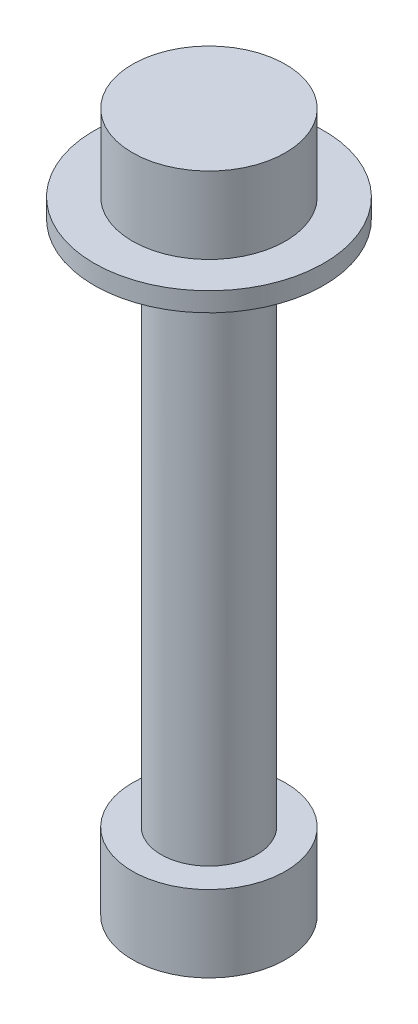
ISO-10303-21;
HEADER;
FILE_DESCRIPTION(('STEP AP214'),'2;1');
FILE_NAME('part.step','',(''),(''),'','','');
FILE_SCHEMA(('AUTOMOTIVE_DESIGN { 1 0 10303 214 1 1 1 1 }'));
ENDSEC;
DATA;
#1=APPLICATION_CONTEXT('core data for automotive mechanical design processes');
#2=APPLICATION_PROTOCOL_DEFINITION('international standard','automotive_design',2000,#1);
#3=PRODUCT_CONTEXT('',#1,'mechanical');
#4=PRODUCT('Part','Part','',(#3));
#5=PRODUCT_RELATED_PRODUCT_CATEGORY('part','',(#4));
#6=PRODUCT_DEFINITION_FORMATION('','',#4);
#7=PRODUCT_DEFINITION_CONTEXT('part definition',#1,'design');
#8=PRODUCT_DEFINITION('design','',#6,#7);
#9=PRODUCT_DEFINITION_SHAPE('','',#8);
#10=(LENGTH_UNIT() NAMED_UNIT(*) SI_UNIT(.MILLI.,.METRE.));
#11=(NAMED_UNIT(*) PLANE_ANGLE_UNIT() SI_UNIT($,.RADIAN.));
#12=(NAMED_UNIT(*) SI_UNIT($,.STERADIAN.) SOLID_ANGLE_UNIT());
#13=UNCERTAINTY_MEASURE_WITH_UNIT(LENGTH_MEASURE(1.E-05),#10,'distance_accuracy_value','');
#14=(GEOMETRIC_REPRESENTATION_CONTEXT(3) GLOBAL_UNCERTAINTY_ASSIGNED_CONTEXT((#13)) GLOBAL_UNIT_ASSIGNED_CONTEXT((#10,
#11,#12)) REPRESENTATION_CONTEXT('',''));
#15=CARTESIAN_POINT('',(0.,0.,0.));
#16=DIRECTION('',(0.,0.,1.));
#17=DIRECTION('',(1.,0.,0.));
#18=AXIS2_PLACEMENT_3D('',#15,#16,#17);
#19=CARTESIAN_POINT('',(0.,36.195,0.));
#20=DIRECTION('',(0.,1.,0.));
#21=DIRECTION('',(0.,0.,1.));
#22=AXIS2_PLACEMENT_3D('',#19,#20,#21);
#23=PLANE('',#22);
#24=CARTESIAN_POINT('',(0.,36.195,0.));
#25=DIRECTION('',(0.,1.,0.));
#26=DIRECTION('',(0.,0.,1.));
#27=AXIS2_PLACEMENT_3D('',#24,#25,#26);
#28=CIRCLE('',#27,7.62);
#29=CARTESIAN_POINT('',(0.,36.195,7.62));
#30=VERTEX_POINT('',#29);
#31=EDGE_CURVE('E38',#30,#30,#28,.T.);
#32=ORIENTED_EDGE('',*,*,#31,.T.);
#33=EDGE_LOOP('',(#32));
#34=FACE_BOUND('',#33,.T.);
#35=CARTESIAN_POINT('',(0.,36.195,0.));
#36=DIRECTION('',(0.,1.,0.));
#37=DIRECTION('',(0.,0.,1.));
#38=AXIS2_PLACEMENT_3D('',#35,#36,#37);
#39=CIRCLE('',#38,5.08);
#40=CARTESIAN_POINT('',(0.,36.195,5.08));
#41=VERTEX_POINT('',#40);
#42=EDGE_CURVE('E58',#41,#41,#39,.T.);
#43=ORIENTED_EDGE('',*,*,#42,.F.);
#44=EDGE_LOOP('',(#43));
#45=FACE_BOUND('',#44,.T.);
#46=ADVANCED_FACE('F31',(#34,#45),#23,.T.);
#47=CARTESIAN_POINT('',(0.,34.925,0.));
#48=DIRECTION('',(0.,-1.,0.));
#49=DIRECTION('',(0.,0.,-1.));
#50=AXIS2_PLACEMENT_3D('',#47,#48,#49);
#51=CYLINDRICAL_SURFACE('',#50,3.175);
#52=CARTESIAN_POINT('',(0.,34.925,0.));
#53=DIRECTION('',(0.,1.,0.));
#54=DIRECTION('',(0.,0.,1.));
#55=AXIS2_PLACEMENT_3D('',#52,#53,#54);
#56=CIRCLE('',#55,3.175);
#57=CARTESIAN_POINT('',(0.,34.925,3.175));
#58=VERTEX_POINT('',#57);
#59=EDGE_CURVE('E10',#58,#58,#56,.T.);
#60=ORIENTED_EDGE('',*,*,#59,.F.);
#61=EDGE_LOOP('',(#60));
#62=FACE_BOUND('',#61,.T.);
#63=CARTESIAN_POINT('',(0.,0.,0.));
#64=DIRECTION('',(0.,-1.,0.));
#65=DIRECTION('',(0.,0.,-1.));
#66=AXIS2_PLACEMENT_3D('',#63,#64,#65);
#67=CIRCLE('',#66,3.175);
#68=CARTESIAN_POINT('',(0.,0.,-3.175));
#69=VERTEX_POINT('',#68);
#70=EDGE_CURVE('E47',#69,#69,#67,.T.);
#71=ORIENTED_EDGE('',*,*,#70,.F.);
#72=EDGE_LOOP('',(#71));
#73=FACE_BOUND('',#72,.T.);
#74=ADVANCED_FACE('F33',(#62,#73),#51,.T.);
#75=CARTESIAN_POINT('',(0.,34.925,0.));
#76=DIRECTION('',(0.,1.,0.));
#77=DIRECTION('',(0.,0.,1.));
#78=AXIS2_PLACEMENT_3D('',#75,#76,#77);
#79=PLANE('',#78);
#80=CARTESIAN_POINT('',(0.,34.925,0.));
#81=DIRECTION('',(0.,1.,0.));
#82=DIRECTION('',(0.,0.,1.));
#83=AXIS2_PLACEMENT_3D('',#80,#81,#82);
#84=CIRCLE('',#83,7.62);
#85=CARTESIAN_POINT('',(0.,34.925,7.62));
#86=VERTEX_POINT('',#85);
#87=EDGE_CURVE('E42',#86,#86,#84,.T.);
#88=ORIENTED_EDGE('',*,*,#87,.F.);
#89=EDGE_LOOP('',(#88));
#90=FACE_BOUND('',#89,.T.);
#91=ORIENTED_EDGE('',*,*,#59,.T.);
#92=EDGE_LOOP('',(#91));
#93=FACE_BOUND('',#92,.T.);
#94=ADVANCED_FACE('F78',(#90,#93),#79,.F.);
#95=CARTESIAN_POINT('',(0.,36.195,0.));
#96=DIRECTION('',(0.,-1.,0.));
#97=DIRECTION('',(0.,0.,-1.));
#98=AXIS2_PLACEMENT_3D('',#95,#96,#97);
#99=CYLINDRICAL_SURFACE('',#98,7.62);
#100=ORIENTED_EDGE('',*,*,#31,.F.);
#101=EDGE_LOOP('',(#100));
#102=FACE_BOUND('',#101,.T.);
#103=ORIENTED_EDGE('',*,*,#87,.T.);
#104=EDGE_LOOP('',(#103));
#105=FACE_BOUND('',#104,.T.);
#106=ADVANCED_FACE('F85',(#102,#105),#99,.T.);
#107=CARTESIAN_POINT('',(0.,0.,0.));
#108=DIRECTION('',(0.,-1.,0.));
#109=DIRECTION('',(0.,0.,-1.));
#110=AXIS2_PLACEMENT_3D('',#107,#108,#109);
#111=PLANE('',#110);
#112=CARTESIAN_POINT('',(0.,0.,0.));
#113=DIRECTION('',(0.,-1.,0.));
#114=DIRECTION('',(0.,0.,-1.));
#115=AXIS2_PLACEMENT_3D('',#112,#113,#114);
#116=CIRCLE('',#115,5.08);
#117=CARTESIAN_POINT('',(0.,0.,-5.08));
#118=VERTEX_POINT('',#117);
#119=EDGE_CURVE('E52',#118,#118,#116,.T.);
#120=ORIENTED_EDGE('',*,*,#119,.F.);
#121=EDGE_LOOP('',(#120));
#122=FACE_BOUND('',#121,.T.);
#123=ORIENTED_EDGE('',*,*,#70,.T.);
#124=EDGE_LOOP('',(#123));
#125=FACE_BOUND('',#124,.T.);
#126=ADVANCED_FACE('F88',(#122,#125),#111,.F.);
#127=CARTESIAN_POINT('',(0.,-5.08,0.));
#128=DIRECTION('',(0.,1.,0.));
#129=DIRECTION('',(0.,0.,1.));
#130=AXIS2_PLACEMENT_3D('',#127,#128,#129);
#131=CYLINDRICAL_SURFACE('',#130,5.08);
#132=CARTESIAN_POINT('',(0.,-5.08,0.));
#133=DIRECTION('',(0.,-1.,0.));
#134=DIRECTION('',(0.,0.,-1.));
#135=AXIS2_PLACEMENT_3D('',#132,#133,#134);
#136=CIRCLE('',#135,5.08);
#137=CARTESIAN_POINT('',(0.,-5.08,-5.08));
#138=VERTEX_POINT('',#137);
#139=EDGE_CURVE('E51',#138,#138,#136,.T.);
#140=ORIENTED_EDGE('',*,*,#139,.F.);
#141=EDGE_LOOP('',(#140));
#142=FACE_BOUND('',#141,.T.);
#143=ORIENTED_EDGE('',*,*,#119,.T.);
#144=EDGE_LOOP('',(#143));
#145=FACE_BOUND('',#144,.T.);
#146=ADVANCED_FACE('F82',(#142,#145),#131,.T.);
#147=CARTESIAN_POINT('',(0.,-5.08,0.));
#148=DIRECTION('',(0.,-1.,0.));
#149=DIRECTION('',(0.,0.,-1.));
#150=AXIS2_PLACEMENT_3D('',#147,#148,#149);
#151=PLANE('',#150);
#152=ORIENTED_EDGE('',*,*,#139,.T.);
#153=EDGE_LOOP('',(#152));
#154=FACE_BOUND('',#153,.T.);
#155=ADVANCED_FACE('F69',(#154),#151,.T.);
#156=CARTESIAN_POINT('',(0.,41.275,0.));
#157=DIRECTION('',(0.,-1.,0.));
#158=DIRECTION('',(0.,0.,-1.));
#159=AXIS2_PLACEMENT_3D('',#156,#157,#158);
#160=CYLINDRICAL_SURFACE('',#159,5.08);
#161=CARTESIAN_POINT('',(0.,41.275,0.));
#162=DIRECTION('',(0.,1.,0.));
#163=DIRECTION('',(0.,0.,1.));
#164=AXIS2_PLACEMENT_3D('',#161,#162,#163);
#165=CIRCLE('',#164,5.08);
#166=CARTESIAN_POINT('',(0.,41.275,5.08));
#167=VERTEX_POINT('',#166);
#168=EDGE_CURVE('E55',#167,#167,#165,.T.);
#169=ORIENTED_EDGE('',*,*,#168,.F.);
#170=EDGE_LOOP('',(#169));
#171=FACE_BOUND('',#170,.T.);
#172=ORIENTED_EDGE('',*,*,#42,.T.);
#173=EDGE_LOOP('',(#172));
#174=FACE_BOUND('',#173,.T.);
#175=ADVANCED_FACE('F66',(#171,#174),#160,.T.);
#176=CARTESIAN_POINT('',(0.,41.275,0.));
#177=DIRECTION('',(0.,1.,0.));
#178=DIRECTION('',(0.,0.,1.));
#179=AXIS2_PLACEMENT_3D('',#176,#177,#178);
#180=PLANE('',#179);
#181=ORIENTED_EDGE('',*,*,#168,.T.);
#182=EDGE_LOOP('',(#181));
#183=FACE_BOUND('',#182,.T.);
#184=ADVANCED_FACE('F64',(#183),#180,.T.);
#185=CLOSED_SHELL('',(#46,#74,#94,#106,#126,#146,#155,#175,#184));
#186=MANIFOLD_SOLID_BREP('B2',#185);
#187=ADVANCED_BREP_SHAPE_REPRESENTATION('',(#18,#186),#14);
#188=SHAPE_DEFINITION_REPRESENTATION(#9,#187);
ENDSEC;
END-ISO-10303-21;
